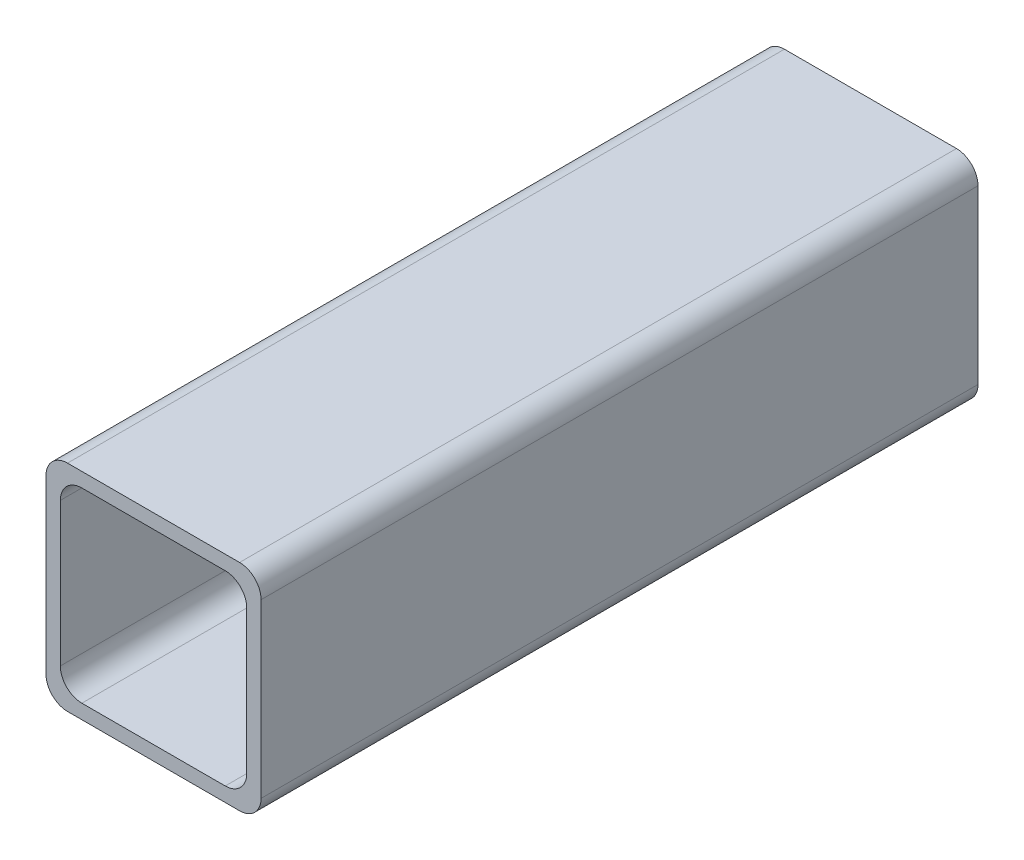
ISO-10303-21;
HEADER;
FILE_DESCRIPTION(('STEP AP214'),'2;1');
FILE_NAME('part.step','',(''),(''),'','','');
FILE_SCHEMA(('AUTOMOTIVE_DESIGN { 1 0 10303 214 1 1 1 1 }'));
ENDSEC;
DATA;
#1=APPLICATION_CONTEXT('core data for automotive mechanical design processes');
#2=APPLICATION_PROTOCOL_DEFINITION('international standard','automotive_design',2000,#1);
#3=PRODUCT_CONTEXT('',#1,'mechanical');
#4=PRODUCT('Part','Part','',(#3));
#5=PRODUCT_RELATED_PRODUCT_CATEGORY('part','',(#4));
#6=PRODUCT_DEFINITION_FORMATION('','',#4);
#7=PRODUCT_DEFINITION_CONTEXT('part definition',#1,'design');
#8=PRODUCT_DEFINITION('design','',#6,#7);
#9=PRODUCT_DEFINITION_SHAPE('','',#8);
#10=(LENGTH_UNIT() NAMED_UNIT(*) SI_UNIT(.MILLI.,.METRE.));
#11=(NAMED_UNIT(*) PLANE_ANGLE_UNIT() SI_UNIT($,.RADIAN.));
#12=(NAMED_UNIT(*) SI_UNIT($,.STERADIAN.) SOLID_ANGLE_UNIT());
#13=UNCERTAINTY_MEASURE_WITH_UNIT(LENGTH_MEASURE(1.E-05),#10,'distance_accuracy_value','');
#14=(GEOMETRIC_REPRESENTATION_CONTEXT(3) GLOBAL_UNCERTAINTY_ASSIGNED_CONTEXT((#13)) GLOBAL_UNIT_ASSIGNED_CONTEXT((#10,
#11,#12)) REPRESENTATION_CONTEXT('',''));
#15=CARTESIAN_POINT('',(0.,0.,0.));
#16=DIRECTION('',(0.,0.,1.));
#17=DIRECTION('',(1.,0.,0.));
#18=AXIS2_PLACEMENT_3D('',#15,#16,#17);
#19=CARTESIAN_POINT('',(12.,-12.,-100.));
#20=DIRECTION('',(0.,0.,1.));
#21=DIRECTION('',(1.,0.,0.));
#22=AXIS2_PLACEMENT_3D('',#19,#20,#21);
#23=CYLINDRICAL_SURFACE('',#22,3.);
#24=CARTESIAN_POINT('',(12.,-12.,0.));
#25=DIRECTION('',(0.,0.,1.));
#26=DIRECTION('',(1.,0.,0.));
#27=AXIS2_PLACEMENT_3D('',#24,#25,#26);
#28=CIRCLE('',#27,3.);
#29=CARTESIAN_POINT('',(12.,-15.,0.));
#30=VERTEX_POINT('',#29);
#31=CARTESIAN_POINT('',(15.,-12.,0.));
#32=VERTEX_POINT('',#31);
#33=EDGE_CURVE('E203',#30,#32,#28,.T.);
#34=ORIENTED_EDGE('',*,*,#33,.F.);
#35=DIRECTION('',(0.,0.,1.));
#36=VECTOR('',#35,1.);
#37=CARTESIAN_POINT('',(12.,-15.,-100.));
#38=LINE('',#37,#36);
#39=CARTESIAN_POINT('',(12.,-15.,-100.));
#40=VERTEX_POINT('',#39);
#41=EDGE_CURVE('E11',#40,#30,#38,.T.);
#42=ORIENTED_EDGE('',*,*,#41,.F.);
#43=CARTESIAN_POINT('',(12.,-12.,-100.));
#44=DIRECTION('',(0.,0.,1.));
#45=DIRECTION('',(1.,0.,0.));
#46=AXIS2_PLACEMENT_3D('',#43,#44,#45);
#47=CIRCLE('',#46,3.);
#48=CARTESIAN_POINT('',(15.,-12.,-100.));
#49=VERTEX_POINT('',#48);
#50=EDGE_CURVE('E215',#40,#49,#47,.T.);
#51=ORIENTED_EDGE('',*,*,#50,.T.);
#52=DIRECTION('',(0.,0.,1.));
#53=VECTOR('',#52,1.);
#54=CARTESIAN_POINT('',(15.,-12.,-100.));
#55=LINE('',#54,#53);
#56=EDGE_CURVE('E36',#49,#32,#55,.T.);
#57=ORIENTED_EDGE('',*,*,#56,.T.);
#58=EDGE_LOOP('',(#34,#42,#51,#57));
#59=FACE_BOUND('',#58,.T.);
#60=ADVANCED_FACE('F33',(#59),#23,.T.);
#61=CARTESIAN_POINT('',(-12.,-15.,-100.));
#62=DIRECTION('',(0.,-1.,0.));
#63=DIRECTION('',(0.,0.,-1.));
#64=AXIS2_PLACEMENT_3D('',#61,#62,#63);
#65=PLANE('',#64);
#66=DIRECTION('',(1.,0.,0.));
#67=VECTOR('',#66,1.);
#68=CARTESIAN_POINT('',(-12.,-15.,0.));
#69=LINE('',#68,#67);
#70=CARTESIAN_POINT('',(-12.,-15.,0.));
#71=VERTEX_POINT('',#70);
#72=EDGE_CURVE('E219',#71,#30,#69,.T.);
#73=ORIENTED_EDGE('',*,*,#72,.F.);
#74=DIRECTION('',(0.,0.,1.));
#75=VECTOR('',#74,1.);
#76=CARTESIAN_POINT('',(-12.,-15.,-100.));
#77=LINE('',#76,#75);
#78=CARTESIAN_POINT('',(-12.,-15.,-100.));
#79=VERTEX_POINT('',#78);
#80=EDGE_CURVE('E41',#79,#71,#77,.T.);
#81=ORIENTED_EDGE('',*,*,#80,.F.);
#82=DIRECTION('',(1.,0.,0.));
#83=VECTOR('',#82,1.);
#84=CARTESIAN_POINT('',(-12.,-15.,-100.));
#85=LINE('',#84,#83);
#86=EDGE_CURVE('E237',#79,#40,#85,.T.);
#87=ORIENTED_EDGE('',*,*,#86,.T.);
#88=ORIENTED_EDGE('',*,*,#41,.T.);
#89=EDGE_LOOP('',(#73,#81,#87,#88));
#90=FACE_BOUND('',#89,.T.);
#91=ADVANCED_FACE('F284',(#90),#65,.T.);
#92=CARTESIAN_POINT('',(-12.,-12.,-100.));
#93=DIRECTION('',(0.,0.,1.));
#94=DIRECTION('',(1.,0.,0.));
#95=AXIS2_PLACEMENT_3D('',#92,#93,#94);
#96=CYLINDRICAL_SURFACE('',#95,3.);
#97=CARTESIAN_POINT('',(-12.,-12.,0.));
#98=DIRECTION('',(0.,0.,1.));
#99=DIRECTION('',(-1.,0.,0.));
#100=AXIS2_PLACEMENT_3D('',#97,#98,#99);
#101=CIRCLE('',#100,3.);
#102=CARTESIAN_POINT('',(-15.,-12.,0.));
#103=VERTEX_POINT('',#102);
#104=EDGE_CURVE('E257',#103,#71,#101,.T.);
#105=ORIENTED_EDGE('',*,*,#104,.F.);
#106=DIRECTION('',(0.,0.,1.));
#107=VECTOR('',#106,1.);
#108=CARTESIAN_POINT('',(-15.,-12.,-100.));
#109=LINE('',#108,#107);
#110=CARTESIAN_POINT('',(-15.,-12.,-100.));
#111=VERTEX_POINT('',#110);
#112=EDGE_CURVE('E263',#111,#103,#109,.T.);
#113=ORIENTED_EDGE('',*,*,#112,.F.);
#114=CARTESIAN_POINT('',(-12.,-12.,-100.));
#115=DIRECTION('',(0.,0.,1.));
#116=DIRECTION('',(-1.,0.,0.));
#117=AXIS2_PLACEMENT_3D('',#114,#115,#116);
#118=CIRCLE('',#117,3.);
#119=EDGE_CURVE('E234',#111,#79,#118,.T.);
#120=ORIENTED_EDGE('',*,*,#119,.T.);
#121=ORIENTED_EDGE('',*,*,#80,.T.);
#122=EDGE_LOOP('',(#105,#113,#120,#121));
#123=FACE_BOUND('',#122,.T.);
#124=ADVANCED_FACE('F303',(#123),#96,.T.);
#125=CARTESIAN_POINT('',(-15.,-12.,-100.));
#126=DIRECTION('',(-1.,0.,0.));
#127=DIRECTION('',(0.,0.,1.));
#128=AXIS2_PLACEMENT_3D('',#125,#126,#127);
#129=PLANE('',#128);
#130=DIRECTION('',(0.,-1.,0.));
#131=VECTOR('',#130,1.);
#132=CARTESIAN_POINT('',(-15.,-12.,0.));
#133=LINE('',#132,#131);
#134=CARTESIAN_POINT('',(-15.,12.,0.));
#135=VERTEX_POINT('',#134);
#136=EDGE_CURVE('E254',#135,#103,#133,.T.);
#137=ORIENTED_EDGE('',*,*,#136,.F.);
#138=DIRECTION('',(0.,0.,1.));
#139=VECTOR('',#138,1.);
#140=CARTESIAN_POINT('',(-15.,12.,-100.));
#141=LINE('',#140,#139);
#142=CARTESIAN_POINT('',(-15.,12.,-100.));
#143=VERTEX_POINT('',#142);
#144=EDGE_CURVE('E265',#143,#135,#141,.T.);
#145=ORIENTED_EDGE('',*,*,#144,.F.);
#146=DIRECTION('',(0.,-1.,0.));
#147=VECTOR('',#146,1.);
#148=CARTESIAN_POINT('',(-15.,-12.,-100.));
#149=LINE('',#148,#147);
#150=EDGE_CURVE('E231',#143,#111,#149,.T.);
#151=ORIENTED_EDGE('',*,*,#150,.T.);
#152=ORIENTED_EDGE('',*,*,#112,.T.);
#153=EDGE_LOOP('',(#137,#145,#151,#152));
#154=FACE_BOUND('',#153,.T.);
#155=ADVANCED_FACE('F301',(#154),#129,.T.);
#156=CARTESIAN_POINT('',(-12.,12.,-100.));
#157=DIRECTION('',(0.,0.,1.));
#158=DIRECTION('',(1.,0.,0.));
#159=AXIS2_PLACEMENT_3D('',#156,#157,#158);
#160=CYLINDRICAL_SURFACE('',#159,3.);
#161=CARTESIAN_POINT('',(-12.,12.,0.));
#162=DIRECTION('',(0.,0.,1.));
#163=DIRECTION('',(-1.,0.,0.));
#164=AXIS2_PLACEMENT_3D('',#161,#162,#163);
#165=CIRCLE('',#164,3.);
#166=CARTESIAN_POINT('',(-12.,15.,0.));
#167=VERTEX_POINT('',#166);
#168=EDGE_CURVE('E251',#167,#135,#165,.T.);
#169=ORIENTED_EDGE('',*,*,#168,.F.);
#170=DIRECTION('',(0.,0.,1.));
#171=VECTOR('',#170,1.);
#172=CARTESIAN_POINT('',(-12.,15.,-100.));
#173=LINE('',#172,#171);
#174=CARTESIAN_POINT('',(-12.,15.,-100.));
#175=VERTEX_POINT('',#174);
#176=EDGE_CURVE('E267',#175,#167,#173,.T.);
#177=ORIENTED_EDGE('',*,*,#176,.F.);
#178=CARTESIAN_POINT('',(-12.,12.,-100.));
#179=DIRECTION('',(0.,0.,1.));
#180=DIRECTION('',(-1.,0.,0.));
#181=AXIS2_PLACEMENT_3D('',#178,#179,#180);
#182=CIRCLE('',#181,3.);
#183=EDGE_CURVE('E228',#175,#143,#182,.T.);
#184=ORIENTED_EDGE('',*,*,#183,.T.);
#185=ORIENTED_EDGE('',*,*,#144,.T.);
#186=EDGE_LOOP('',(#169,#177,#184,#185));
#187=FACE_BOUND('',#186,.T.);
#188=ADVANCED_FACE('F297',(#187),#160,.T.);
#189=CARTESIAN_POINT('',(-12.,15.,-100.));
#190=DIRECTION('',(0.,1.,0.));
#191=DIRECTION('',(0.,0.,1.));
#192=AXIS2_PLACEMENT_3D('',#189,#190,#191);
#193=PLANE('',#192);
#194=DIRECTION('',(-1.,0.,0.));
#195=VECTOR('',#194,1.);
#196=CARTESIAN_POINT('',(-12.,15.,0.));
#197=LINE('',#196,#195);
#198=CARTESIAN_POINT('',(12.,15.,0.));
#199=VERTEX_POINT('',#198);
#200=EDGE_CURVE('E248',#199,#167,#197,.T.);
#201=ORIENTED_EDGE('',*,*,#200,.F.);
#202=DIRECTION('',(0.,0.,1.));
#203=VECTOR('',#202,1.);
#204=CARTESIAN_POINT('',(12.,15.,-100.));
#205=LINE('',#204,#203);
#206=CARTESIAN_POINT('',(12.,15.,-100.));
#207=VERTEX_POINT('',#206);
#208=EDGE_CURVE('E269',#207,#199,#205,.T.);
#209=ORIENTED_EDGE('',*,*,#208,.F.);
#210=DIRECTION('',(-1.,0.,0.));
#211=VECTOR('',#210,1.);
#212=CARTESIAN_POINT('',(-12.,15.,-100.));
#213=LINE('',#212,#211);
#214=EDGE_CURVE('E225',#207,#175,#213,.T.);
#215=ORIENTED_EDGE('',*,*,#214,.T.);
#216=ORIENTED_EDGE('',*,*,#176,.T.);
#217=EDGE_LOOP('',(#201,#209,#215,#216));
#218=FACE_BOUND('',#217,.T.);
#219=ADVANCED_FACE('F295',(#218),#193,.T.);
#220=CARTESIAN_POINT('',(12.,12.,-100.));
#221=DIRECTION('',(0.,0.,1.));
#222=DIRECTION('',(1.,0.,0.));
#223=AXIS2_PLACEMENT_3D('',#220,#221,#222);
#224=CYLINDRICAL_SURFACE('',#223,3.);
#225=CARTESIAN_POINT('',(12.,12.,0.));
#226=DIRECTION('',(0.,0.,1.));
#227=DIRECTION('',(-1.,0.,0.));
#228=AXIS2_PLACEMENT_3D('',#225,#226,#227);
#229=CIRCLE('',#228,3.);
#230=CARTESIAN_POINT('',(15.,12.,0.));
#231=VERTEX_POINT('',#230);
#232=EDGE_CURVE('E245',#231,#199,#229,.T.);
#233=ORIENTED_EDGE('',*,*,#232,.F.);
#234=DIRECTION('',(0.,0.,1.));
#235=VECTOR('',#234,1.);
#236=CARTESIAN_POINT('',(15.,12.,-100.));
#237=LINE('',#236,#235);
#238=CARTESIAN_POINT('',(15.,12.,-100.));
#239=VERTEX_POINT('',#238);
#240=EDGE_CURVE('E270',#239,#231,#237,.T.);
#241=ORIENTED_EDGE('',*,*,#240,.F.);
#242=CARTESIAN_POINT('',(12.,12.,-100.));
#243=DIRECTION('',(0.,0.,1.));
#244=DIRECTION('',(-1.,0.,0.));
#245=AXIS2_PLACEMENT_3D('',#242,#243,#244);
#246=CIRCLE('',#245,3.);
#247=EDGE_CURVE('E222',#239,#207,#246,.T.);
#248=ORIENTED_EDGE('',*,*,#247,.T.);
#249=ORIENTED_EDGE('',*,*,#208,.T.);
#250=EDGE_LOOP('',(#233,#241,#248,#249));
#251=FACE_BOUND('',#250,.T.);
#252=ADVANCED_FACE('F291',(#251),#224,.T.);
#253=CARTESIAN_POINT('',(15.,-12.,-100.));
#254=DIRECTION('',(1.,0.,0.));
#255=DIRECTION('',(0.,0.,-1.));
#256=AXIS2_PLACEMENT_3D('',#253,#254,#255);
#257=PLANE('',#256);
#258=DIRECTION('',(0.,1.,0.));
#259=VECTOR('',#258,1.);
#260=CARTESIAN_POINT('',(15.,-12.,0.));
#261=LINE('',#260,#259);
#262=EDGE_CURVE('E242',#32,#231,#261,.T.);
#263=ORIENTED_EDGE('',*,*,#262,.F.);
#264=ORIENTED_EDGE('',*,*,#56,.F.);
#265=DIRECTION('',(0.,1.,0.));
#266=VECTOR('',#265,1.);
#267=CARTESIAN_POINT('',(15.,-12.,-100.));
#268=LINE('',#267,#266);
#269=EDGE_CURVE('E218',#49,#239,#268,.T.);
#270=ORIENTED_EDGE('',*,*,#269,.T.);
#271=ORIENTED_EDGE('',*,*,#240,.T.);
#272=EDGE_LOOP('',(#263,#264,#270,#271));
#273=FACE_BOUND('',#272,.T.);
#274=ADVANCED_FACE('F278',(#273),#257,.T.);
#275=CARTESIAN_POINT('',(12.,-12.,-100.));
#276=DIRECTION('',(0.,0.,1.));
#277=DIRECTION('',(1.,0.,0.));
#278=AXIS2_PLACEMENT_3D('',#275,#276,#277);
#279=PLANE('',#278);
#280=DIRECTION('',(1.,0.,0.));
#281=VECTOR('',#280,1.);
#282=CARTESIAN_POINT('',(-9.99999999999998,-13.,-100.));
#283=LINE('',#282,#281);
#284=CARTESIAN_POINT('',(-9.99999999999998,-13.,-100.));
#285=VERTEX_POINT('',#284);
#286=CARTESIAN_POINT('',(9.99999999999998,-13.,-100.));
#287=VERTEX_POINT('',#286);
#288=EDGE_CURVE('E154',#285,#287,#283,.T.);
#289=ORIENTED_EDGE('',*,*,#288,.T.);
#290=CARTESIAN_POINT('',(10.,-10.,-100.));
#291=DIRECTION('',(0.,0.,1.));
#292=DIRECTION('',(1.,0.,0.));
#293=AXIS2_PLACEMENT_3D('',#290,#291,#292);
#294=CIRCLE('',#293,3.);
#295=CARTESIAN_POINT('',(13.,-9.99999999999998,-100.));
#296=VERTEX_POINT('',#295);
#297=EDGE_CURVE('E148',#287,#296,#294,.T.);
#298=ORIENTED_EDGE('',*,*,#297,.T.);
#299=DIRECTION('',(0.,1.,0.));
#300=VECTOR('',#299,1.);
#301=CARTESIAN_POINT('',(13.,-9.99999999999998,-100.));
#302=LINE('',#301,#300);
#303=CARTESIAN_POINT('',(13.,9.99999999999998,-100.));
#304=VERTEX_POINT('',#303);
#305=EDGE_CURVE('E157',#296,#304,#302,.T.);
#306=ORIENTED_EDGE('',*,*,#305,.T.);
#307=CARTESIAN_POINT('',(10.,10.,-100.));
#308=DIRECTION('',(0.,0.,1.));
#309=DIRECTION('',(-1.,0.,0.));
#310=AXIS2_PLACEMENT_3D('',#307,#308,#309);
#311=CIRCLE('',#310,3.);
#312=CARTESIAN_POINT('',(9.99999999999998,13.,-100.));
#313=VERTEX_POINT('',#312);
#314=EDGE_CURVE('E49',#304,#313,#311,.T.);
#315=ORIENTED_EDGE('',*,*,#314,.T.);
#316=DIRECTION('',(-1.,0.,0.));
#317=VECTOR('',#316,1.);
#318=CARTESIAN_POINT('',(-9.99999999999998,13.,-100.));
#319=LINE('',#318,#317);
#320=CARTESIAN_POINT('',(-9.99999999999998,13.,-100.));
#321=VERTEX_POINT('',#320);
#322=EDGE_CURVE('E172',#313,#321,#319,.T.);
#323=ORIENTED_EDGE('',*,*,#322,.T.);
#324=CARTESIAN_POINT('',(-10.,10.,-100.));
#325=DIRECTION('',(0.,0.,1.));
#326=DIRECTION('',(-1.,0.,0.));
#327=AXIS2_PLACEMENT_3D('',#324,#325,#326);
#328=CIRCLE('',#327,3.);
#329=CARTESIAN_POINT('',(-13.,9.99999999999998,-100.));
#330=VERTEX_POINT('',#329);
#331=EDGE_CURVE('E175',#321,#330,#328,.T.);
#332=ORIENTED_EDGE('',*,*,#331,.T.);
#333=DIRECTION('',(0.,-1.,0.));
#334=VECTOR('',#333,1.);
#335=CARTESIAN_POINT('',(-13.,-9.99999999999998,-100.));
#336=LINE('',#335,#334);
#337=CARTESIAN_POINT('',(-13.,-10.,-100.));
#338=VERTEX_POINT('',#337);
#339=EDGE_CURVE('E178',#330,#338,#336,.T.);
#340=ORIENTED_EDGE('',*,*,#339,.T.);
#341=CARTESIAN_POINT('',(-10.,-10.,-100.));
#342=DIRECTION('',(0.,0.,1.));
#343=DIRECTION('',(-1.,0.,0.));
#344=AXIS2_PLACEMENT_3D('',#341,#342,#343);
#345=CIRCLE('',#344,3.);
#346=EDGE_CURVE('E181',#338,#285,#345,.T.);
#347=ORIENTED_EDGE('',*,*,#346,.T.);
#348=EDGE_LOOP('',(#289,#298,#306,#315,#323,#332,#340,#347));
#349=FACE_BOUND('',#348,.T.);
#350=ORIENTED_EDGE('',*,*,#50,.F.);
#351=ORIENTED_EDGE('',*,*,#86,.F.);
#352=ORIENTED_EDGE('',*,*,#119,.F.);
#353=ORIENTED_EDGE('',*,*,#150,.F.);
#354=ORIENTED_EDGE('',*,*,#183,.F.);
#355=ORIENTED_EDGE('',*,*,#214,.F.);
#356=ORIENTED_EDGE('',*,*,#247,.F.);
#357=ORIENTED_EDGE('',*,*,#269,.F.);
#358=EDGE_LOOP('',(#350,#351,#352,#353,#354,#355,#356,#357));
#359=FACE_BOUND('',#358,.T.);
#360=ADVANCED_FACE('F161',(#349,#359),#279,.F.);
#361=CARTESIAN_POINT('',(12.,-12.,0.));
#362=DIRECTION('',(0.,0.,1.));
#363=DIRECTION('',(1.,0.,0.));
#364=AXIS2_PLACEMENT_3D('',#361,#362,#363);
#365=PLANE('',#364);
#366=CARTESIAN_POINT('',(10.,-10.,0.));
#367=DIRECTION('',(0.,0.,1.));
#368=DIRECTION('',(1.,0.,0.));
#369=AXIS2_PLACEMENT_3D('',#366,#367,#368);
#370=CIRCLE('',#369,3.);
#371=CARTESIAN_POINT('',(9.99999999999998,-13.,0.));
#372=VERTEX_POINT('',#371);
#373=CARTESIAN_POINT('',(13.,-9.99999999999998,0.));
#374=VERTEX_POINT('',#373);
#375=EDGE_CURVE('E57',#372,#374,#370,.T.);
#376=ORIENTED_EDGE('',*,*,#375,.F.);
#377=DIRECTION('',(1.,0.,0.));
#378=VECTOR('',#377,1.);
#379=CARTESIAN_POINT('',(-9.99999999999998,-13.,0.));
#380=LINE('',#379,#378);
#381=CARTESIAN_POINT('',(-9.99999999999998,-13.,0.));
#382=VERTEX_POINT('',#381);
#383=EDGE_CURVE('E165',#382,#372,#380,.T.);
#384=ORIENTED_EDGE('',*,*,#383,.F.);
#385=CARTESIAN_POINT('',(-10.,-10.,0.));
#386=DIRECTION('',(0.,0.,1.));
#387=DIRECTION('',(-1.,0.,0.));
#388=AXIS2_PLACEMENT_3D('',#385,#386,#387);
#389=CIRCLE('',#388,3.);
#390=CARTESIAN_POINT('',(-13.,-10.,0.));
#391=VERTEX_POINT('',#390);
#392=EDGE_CURVE('E168',#391,#382,#389,.T.);
#393=ORIENTED_EDGE('',*,*,#392,.F.);
#394=DIRECTION('',(0.,-1.,0.));
#395=VECTOR('',#394,1.);
#396=CARTESIAN_POINT('',(-13.,-9.99999999999998,0.));
#397=LINE('',#396,#395);
#398=CARTESIAN_POINT('',(-13.,9.99999999999998,0.));
#399=VERTEX_POINT('',#398);
#400=EDGE_CURVE('E196',#399,#391,#397,.T.);
#401=ORIENTED_EDGE('',*,*,#400,.F.);
#402=CARTESIAN_POINT('',(-10.,10.,0.));
#403=DIRECTION('',(0.,0.,1.));
#404=DIRECTION('',(-1.,0.,0.));
#405=AXIS2_PLACEMENT_3D('',#402,#403,#404);
#406=CIRCLE('',#405,3.);
#407=CARTESIAN_POINT('',(-9.99999999999998,13.,0.));
#408=VERTEX_POINT('',#407);
#409=EDGE_CURVE('E193',#408,#399,#406,.T.);
#410=ORIENTED_EDGE('',*,*,#409,.F.);
#411=DIRECTION('',(-1.,0.,0.));
#412=VECTOR('',#411,1.);
#413=CARTESIAN_POINT('',(-9.99999999999998,13.,0.));
#414=LINE('',#413,#412);
#415=CARTESIAN_POINT('',(9.99999999999998,13.,0.));
#416=VERTEX_POINT('',#415);
#417=EDGE_CURVE('E190',#416,#408,#414,.T.);
#418=ORIENTED_EDGE('',*,*,#417,.F.);
#419=CARTESIAN_POINT('',(10.,10.,0.));
#420=DIRECTION('',(0.,0.,1.));
#421=DIRECTION('',(-1.,0.,0.));
#422=AXIS2_PLACEMENT_3D('',#419,#420,#421);
#423=CIRCLE('',#422,3.);
#424=CARTESIAN_POINT('',(13.,9.99999999999998,0.));
#425=VERTEX_POINT('',#424);
#426=EDGE_CURVE('E187',#425,#416,#423,.T.);
#427=ORIENTED_EDGE('',*,*,#426,.F.);
#428=DIRECTION('',(0.,1.,0.));
#429=VECTOR('',#428,1.);
#430=CARTESIAN_POINT('',(13.,-9.99999999999998,0.));
#431=LINE('',#430,#429);
#432=EDGE_CURVE('E185',#374,#425,#431,.T.);
#433=ORIENTED_EDGE('',*,*,#432,.F.);
#434=EDGE_LOOP('',(#376,#384,#393,#401,#410,#418,#427,#433));
#435=FACE_BOUND('',#434,.T.);
#436=ORIENTED_EDGE('',*,*,#33,.T.);
#437=ORIENTED_EDGE('',*,*,#262,.T.);
#438=ORIENTED_EDGE('',*,*,#232,.T.);
#439=ORIENTED_EDGE('',*,*,#200,.T.);
#440=ORIENTED_EDGE('',*,*,#168,.T.);
#441=ORIENTED_EDGE('',*,*,#136,.T.);
#442=ORIENTED_EDGE('',*,*,#104,.T.);
#443=ORIENTED_EDGE('',*,*,#72,.T.);
#444=EDGE_LOOP('',(#436,#437,#438,#439,#440,#441,#442,#443));
#445=FACE_BOUND('',#444,.T.);
#446=ADVANCED_FACE('F280',(#435,#445),#365,.T.);
#447=CARTESIAN_POINT('',(10.,-10.,-100.));
#448=DIRECTION('',(0.,0.,1.));
#449=DIRECTION('',(1.,0.,0.));
#450=AXIS2_PLACEMENT_3D('',#447,#448,#449);
#451=CYLINDRICAL_SURFACE('',#450,3.);
#452=ORIENTED_EDGE('',*,*,#375,.T.);
#453=DIRECTION('',(0.,0.,1.));
#454=VECTOR('',#453,1.);
#455=CARTESIAN_POINT('',(13.,-9.99999999999998,-100.));
#456=LINE('',#455,#454);
#457=EDGE_CURVE('E144',#296,#374,#456,.T.);
#458=ORIENTED_EDGE('',*,*,#457,.F.);
#459=ORIENTED_EDGE('',*,*,#297,.F.);
#460=DIRECTION('',(0.,0.,1.));
#461=VECTOR('',#460,1.);
#462=CARTESIAN_POINT('',(9.99999999999998,-13.,-100.));
#463=LINE('',#462,#461);
#464=EDGE_CURVE('E201',#287,#372,#463,.T.);
#465=ORIENTED_EDGE('',*,*,#464,.T.);
#466=EDGE_LOOP('',(#452,#458,#459,#465));
#467=FACE_BOUND('',#466,.T.);
#468=ADVANCED_FACE('F146',(#467),#451,.F.);
#469=CARTESIAN_POINT('',(-9.99999999999998,-13.,-100.));
#470=DIRECTION('',(0.,-1.,0.));
#471=DIRECTION('',(1.,0.,0.));
#472=AXIS2_PLACEMENT_3D('',#469,#470,#471);
#473=PLANE('',#472);
#474=ORIENTED_EDGE('',*,*,#383,.T.);
#475=ORIENTED_EDGE('',*,*,#464,.F.);
#476=ORIENTED_EDGE('',*,*,#288,.F.);
#477=DIRECTION('',(0.,0.,1.));
#478=VECTOR('',#477,1.);
#479=CARTESIAN_POINT('',(-9.99999999999998,-13.,-100.));
#480=LINE('',#479,#478);
#481=EDGE_CURVE('E204',#285,#382,#480,.T.);
#482=ORIENTED_EDGE('',*,*,#481,.T.);
#483=EDGE_LOOP('',(#474,#475,#476,#482));
#484=FACE_BOUND('',#483,.T.);
#485=ADVANCED_FACE('F386',(#484),#473,.F.);
#486=CARTESIAN_POINT('',(-10.,-10.,-100.));
#487=DIRECTION('',(0.,0.,1.));
#488=DIRECTION('',(1.,0.,0.));
#489=AXIS2_PLACEMENT_3D('',#486,#487,#488);
#490=CYLINDRICAL_SURFACE('',#489,3.);
#491=ORIENTED_EDGE('',*,*,#392,.T.);
#492=ORIENTED_EDGE('',*,*,#481,.F.);
#493=ORIENTED_EDGE('',*,*,#346,.F.);
#494=DIRECTION('',(0.,0.,1.));
#495=VECTOR('',#494,1.);
#496=CARTESIAN_POINT('',(-13.,-10.,-100.));
#497=LINE('',#496,#495);
#498=EDGE_CURVE('E206',#338,#391,#497,.T.);
#499=ORIENTED_EDGE('',*,*,#498,.T.);
#500=EDGE_LOOP('',(#491,#492,#493,#499));
#501=FACE_BOUND('',#500,.T.);
#502=ADVANCED_FACE('F395',(#501),#490,.F.);
#503=CARTESIAN_POINT('',(-13.,-9.99999999999998,-100.));
#504=DIRECTION('',(-1.,0.,0.));
#505=DIRECTION('',(0.,0.,1.));
#506=AXIS2_PLACEMENT_3D('',#503,#504,#505);
#507=PLANE('',#506);
#508=ORIENTED_EDGE('',*,*,#400,.T.);
#509=ORIENTED_EDGE('',*,*,#498,.F.);
#510=ORIENTED_EDGE('',*,*,#339,.F.);
#511=DIRECTION('',(0.,0.,1.));
#512=VECTOR('',#511,1.);
#513=CARTESIAN_POINT('',(-13.,9.99999999999998,-100.));
#514=LINE('',#513,#512);
#515=EDGE_CURVE('E208',#330,#399,#514,.T.);
#516=ORIENTED_EDGE('',*,*,#515,.T.);
#517=EDGE_LOOP('',(#508,#509,#510,#516));
#518=FACE_BOUND('',#517,.T.);
#519=ADVANCED_FACE('F405',(#518),#507,.F.);
#520=CARTESIAN_POINT('',(-10.,10.,-100.));
#521=DIRECTION('',(0.,0.,1.));
#522=DIRECTION('',(1.,0.,0.));
#523=AXIS2_PLACEMENT_3D('',#520,#521,#522);
#524=CYLINDRICAL_SURFACE('',#523,3.);
#525=ORIENTED_EDGE('',*,*,#409,.T.);
#526=ORIENTED_EDGE('',*,*,#515,.F.);
#527=ORIENTED_EDGE('',*,*,#331,.F.);
#528=DIRECTION('',(0.,0.,1.));
#529=VECTOR('',#528,1.);
#530=CARTESIAN_POINT('',(-9.99999999999998,13.,-100.));
#531=LINE('',#530,#529);
#532=EDGE_CURVE('E210',#321,#408,#531,.T.);
#533=ORIENTED_EDGE('',*,*,#532,.T.);
#534=EDGE_LOOP('',(#525,#526,#527,#533));
#535=FACE_BOUND('',#534,.T.);
#536=ADVANCED_FACE('F415',(#535),#524,.F.);
#537=CARTESIAN_POINT('',(-9.99999999999998,13.,-100.));
#538=DIRECTION('',(0.,1.,0.));
#539=DIRECTION('',(-1.,0.,0.));
#540=AXIS2_PLACEMENT_3D('',#537,#538,#539);
#541=PLANE('',#540);
#542=ORIENTED_EDGE('',*,*,#417,.T.);
#543=ORIENTED_EDGE('',*,*,#532,.F.);
#544=ORIENTED_EDGE('',*,*,#322,.F.);
#545=DIRECTION('',(0.,0.,1.));
#546=VECTOR('',#545,1.);
#547=CARTESIAN_POINT('',(9.99999999999998,13.,-100.));
#548=LINE('',#547,#546);
#549=EDGE_CURVE('E212',#313,#416,#548,.T.);
#550=ORIENTED_EDGE('',*,*,#549,.T.);
#551=EDGE_LOOP('',(#542,#543,#544,#550));
#552=FACE_BOUND('',#551,.T.);
#553=ADVANCED_FACE('F425',(#552),#541,.F.);
#554=CARTESIAN_POINT('',(10.,10.,-100.));
#555=DIRECTION('',(0.,0.,1.));
#556=DIRECTION('',(1.,0.,0.));
#557=AXIS2_PLACEMENT_3D('',#554,#555,#556);
#558=CYLINDRICAL_SURFACE('',#557,3.);
#559=ORIENTED_EDGE('',*,*,#426,.T.);
#560=ORIENTED_EDGE('',*,*,#549,.F.);
#561=ORIENTED_EDGE('',*,*,#314,.F.);
#562=DIRECTION('',(0.,0.,1.));
#563=VECTOR('',#562,1.);
#564=CARTESIAN_POINT('',(13.,9.99999999999998,-100.));
#565=LINE('',#564,#563);
#566=EDGE_CURVE('E153',#304,#425,#565,.T.);
#567=ORIENTED_EDGE('',*,*,#566,.T.);
#568=EDGE_LOOP('',(#559,#560,#561,#567));
#569=FACE_BOUND('',#568,.T.);
#570=ADVANCED_FACE('F435',(#569),#558,.F.);
#571=CARTESIAN_POINT('',(13.,-9.99999999999998,-100.));
#572=DIRECTION('',(1.,0.,0.));
#573=DIRECTION('',(0.,0.,-1.));
#574=AXIS2_PLACEMENT_3D('',#571,#572,#573);
#575=PLANE('',#574);
#576=ORIENTED_EDGE('',*,*,#432,.T.);
#577=ORIENTED_EDGE('',*,*,#566,.F.);
#578=ORIENTED_EDGE('',*,*,#305,.F.);
#579=ORIENTED_EDGE('',*,*,#457,.T.);
#580=EDGE_LOOP('',(#576,#577,#578,#579));
#581=FACE_BOUND('',#580,.T.);
#582=ADVANCED_FACE('F158',(#581),#575,.F.);
#583=CLOSED_SHELL('',(#60,#91,#124,#155,#188,#219,#252,#274,#360,#446,#468,#485,#502,#519,#536,
#553,#570,#582));
#584=MANIFOLD_SOLID_BREP('B2',#583);
#585=ADVANCED_BREP_SHAPE_REPRESENTATION('',(#18,#584),#14);
#586=SHAPE_DEFINITION_REPRESENTATION(#9,#585);
ENDSEC;
END-ISO-10303-21;
